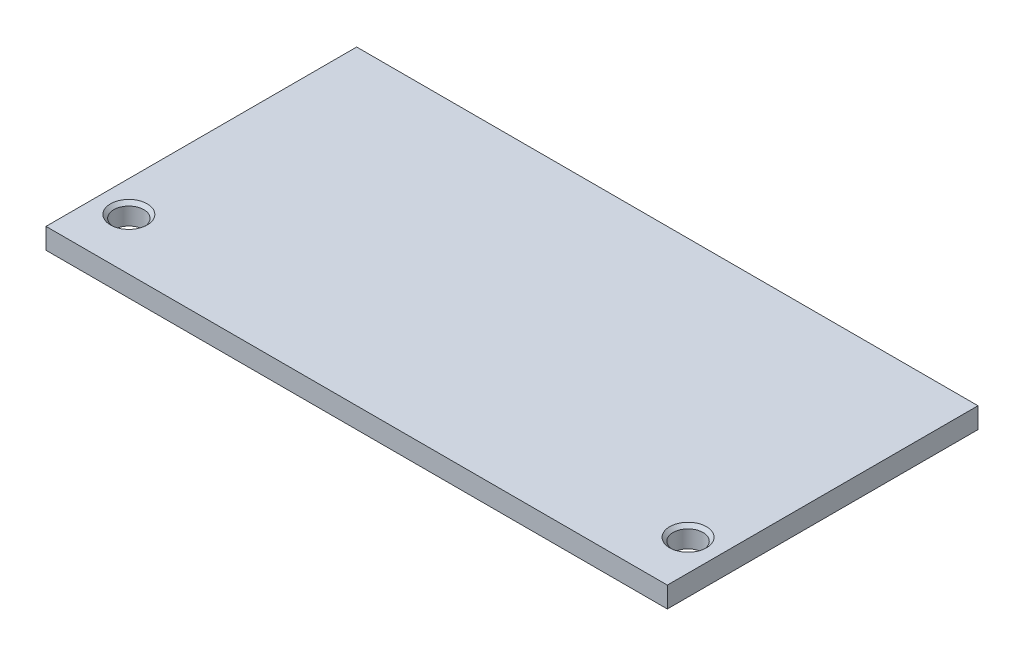
ISO-10303-21;
HEADER;
FILE_DESCRIPTION(('STEP AP214'),'2;1');
FILE_NAME('part.step','',(''),(''),'','','');
FILE_SCHEMA(('AUTOMOTIVE_DESIGN { 1 0 10303 214 1 1 1 1 }'));
ENDSEC;
DATA;
#1=APPLICATION_CONTEXT('core data for automotive mechanical design processes');
#2=APPLICATION_PROTOCOL_DEFINITION('international standard','automotive_design',2000,#1);
#3=PRODUCT_CONTEXT('',#1,'mechanical');
#4=PRODUCT('Part','Part','',(#3));
#5=PRODUCT_RELATED_PRODUCT_CATEGORY('part','',(#4));
#6=PRODUCT_DEFINITION_FORMATION('','',#4);
#7=PRODUCT_DEFINITION_CONTEXT('part definition',#1,'design');
#8=PRODUCT_DEFINITION('design','',#6,#7);
#9=PRODUCT_DEFINITION_SHAPE('','',#8);
#10=(LENGTH_UNIT() NAMED_UNIT(*) SI_UNIT(.MILLI.,.METRE.));
#11=(NAMED_UNIT(*) PLANE_ANGLE_UNIT() SI_UNIT($,.RADIAN.));
#12=(NAMED_UNIT(*) SI_UNIT($,.STERADIAN.) SOLID_ANGLE_UNIT());
#13=UNCERTAINTY_MEASURE_WITH_UNIT(LENGTH_MEASURE(1.E-05),#10,'distance_accuracy_value','');
#14=(GEOMETRIC_REPRESENTATION_CONTEXT(3) GLOBAL_UNCERTAINTY_ASSIGNED_CONTEXT((#13)) GLOBAL_UNIT_ASSIGNED_CONTEXT((#10,
#11,#12)) REPRESENTATION_CONTEXT('',''));
#15=CARTESIAN_POINT('',(0.,0.,0.));
#16=DIRECTION('',(0.,0.,1.));
#17=DIRECTION('',(1.,0.,0.));
#18=AXIS2_PLACEMENT_3D('',#15,#16,#17);
#19=CARTESIAN_POINT('',(0.,2.,0.));
#20=DIRECTION('',(1.,0.,0.));
#21=DIRECTION('',(0.,0.,-1.));
#22=AXIS2_PLACEMENT_3D('',#19,#20,#21);
#23=PLANE('',#22);
#24=DIRECTION('',(0.,0.,1.));
#25=VECTOR('',#24,1.);
#26=CARTESIAN_POINT('',(0.,0.,0.));
#27=LINE('',#26,#25);
#28=CARTESIAN_POINT('',(0.,0.,-30.));
#29=VERTEX_POINT('',#28);
#30=CARTESIAN_POINT('',(0.,0.,0.));
#31=VERTEX_POINT('',#30);
#32=EDGE_CURVE('E103',#29,#31,#27,.T.);
#33=ORIENTED_EDGE('',*,*,#32,.T.);
#34=DIRECTION('',(0.,-1.,0.));
#35=VECTOR('',#34,1.);
#36=CARTESIAN_POINT('',(0.,2.,0.));
#37=LINE('',#36,#35);
#38=CARTESIAN_POINT('',(0.,2.,0.));
#39=VERTEX_POINT('',#38);
#40=EDGE_CURVE('E11',#39,#31,#37,.T.);
#41=ORIENTED_EDGE('',*,*,#40,.F.);
#42=DIRECTION('',(0.,0.,1.));
#43=VECTOR('',#42,1.);
#44=CARTESIAN_POINT('',(0.,2.,0.));
#45=LINE('',#44,#43);
#46=CARTESIAN_POINT('',(0.,2.,-30.));
#47=VERTEX_POINT('',#46);
#48=EDGE_CURVE('E91',#47,#39,#45,.T.);
#49=ORIENTED_EDGE('',*,*,#48,.F.);
#50=DIRECTION('',(0.,-1.,0.));
#51=VECTOR('',#50,1.);
#52=CARTESIAN_POINT('',(0.,2.,-30.));
#53=LINE('',#52,#51);
#54=EDGE_CURVE('E99',#47,#29,#53,.T.);
#55=ORIENTED_EDGE('',*,*,#54,.T.);
#56=EDGE_LOOP('',(#33,#41,#49,#55));
#57=FACE_BOUND('',#56,.T.);
#58=ADVANCED_FACE('F40',(#57),#23,.F.);
#59=CARTESIAN_POINT('',(0.,2.,0.));
#60=DIRECTION('',(0.,0.,-1.));
#61=DIRECTION('',(-1.,0.,0.));
#62=AXIS2_PLACEMENT_3D('',#59,#60,#61);
#63=PLANE('',#62);
#64=DIRECTION('',(1.,0.,0.));
#65=VECTOR('',#64,1.);
#66=CARTESIAN_POINT('',(0.,0.,0.));
#67=LINE('',#66,#65);
#68=CARTESIAN_POINT('',(60.,0.,0.));
#69=VERTEX_POINT('',#68);
#70=EDGE_CURVE('E95',#31,#69,#67,.T.);
#71=ORIENTED_EDGE('',*,*,#70,.T.);
#72=DIRECTION('',(0.,-1.,0.));
#73=VECTOR('',#72,1.);
#74=CARTESIAN_POINT('',(60.,2.,0.));
#75=LINE('',#74,#73);
#76=CARTESIAN_POINT('',(60.,2.,0.));
#77=VERTEX_POINT('',#76);
#78=EDGE_CURVE('E48',#77,#69,#75,.T.);
#79=ORIENTED_EDGE('',*,*,#78,.F.);
#80=DIRECTION('',(1.,0.,0.));
#81=VECTOR('',#80,1.);
#82=CARTESIAN_POINT('',(0.,2.,0.));
#83=LINE('',#82,#81);
#84=EDGE_CURVE('E86',#39,#77,#83,.T.);
#85=ORIENTED_EDGE('',*,*,#84,.F.);
#86=ORIENTED_EDGE('',*,*,#40,.T.);
#87=EDGE_LOOP('',(#71,#79,#85,#86));
#88=FACE_BOUND('',#87,.T.);
#89=ADVANCED_FACE('F94',(#88),#63,.F.);
#90=CARTESIAN_POINT('',(60.,2.,0.));
#91=DIRECTION('',(-1.,0.,0.));
#92=DIRECTION('',(0.,0.,1.));
#93=AXIS2_PLACEMENT_3D('',#90,#91,#92);
#94=PLANE('',#93);
#95=DIRECTION('',(0.,0.,-1.));
#96=VECTOR('',#95,1.);
#97=CARTESIAN_POINT('',(60.,0.,0.));
#98=LINE('',#97,#96);
#99=CARTESIAN_POINT('',(60.,0.,-30.));
#100=VERTEX_POINT('',#99);
#101=EDGE_CURVE('E73',#69,#100,#98,.T.);
#102=ORIENTED_EDGE('',*,*,#101,.T.);
#103=DIRECTION('',(0.,-1.,0.));
#104=VECTOR('',#103,1.);
#105=CARTESIAN_POINT('',(60.,2.,-30.));
#106=LINE('',#105,#104);
#107=CARTESIAN_POINT('',(60.,2.,-30.));
#108=VERTEX_POINT('',#107);
#109=EDGE_CURVE('E96',#108,#100,#106,.T.);
#110=ORIENTED_EDGE('',*,*,#109,.F.);
#111=DIRECTION('',(0.,0.,-1.));
#112=VECTOR('',#111,1.);
#113=CARTESIAN_POINT('',(60.,2.,0.));
#114=LINE('',#113,#112);
#115=EDGE_CURVE('E89',#77,#108,#114,.T.);
#116=ORIENTED_EDGE('',*,*,#115,.F.);
#117=ORIENTED_EDGE('',*,*,#78,.T.);
#118=EDGE_LOOP('',(#102,#110,#116,#117));
#119=FACE_BOUND('',#118,.T.);
#120=ADVANCED_FACE('F97',(#119),#94,.F.);
#121=CARTESIAN_POINT('',(0.,2.,-30.));
#122=DIRECTION('',(0.,0.,1.));
#123=DIRECTION('',(1.,0.,0.));
#124=AXIS2_PLACEMENT_3D('',#121,#122,#123);
#125=PLANE('',#124);
#126=DIRECTION('',(-1.,0.,0.));
#127=VECTOR('',#126,1.);
#128=CARTESIAN_POINT('',(0.,0.,-30.));
#129=LINE('',#128,#127);
#130=EDGE_CURVE('E79',#100,#29,#129,.T.);
#131=ORIENTED_EDGE('',*,*,#130,.T.);
#132=ORIENTED_EDGE('',*,*,#54,.F.);
#133=DIRECTION('',(-1.,0.,0.));
#134=VECTOR('',#133,1.);
#135=CARTESIAN_POINT('',(0.,2.,-30.));
#136=LINE('',#135,#134);
#137=EDGE_CURVE('E56',#108,#47,#136,.T.);
#138=ORIENTED_EDGE('',*,*,#137,.F.);
#139=ORIENTED_EDGE('',*,*,#109,.T.);
#140=EDGE_LOOP('',(#131,#132,#138,#139));
#141=FACE_BOUND('',#140,.T.);
#142=ADVANCED_FACE('F111',(#141),#125,.F.);
#143=CARTESIAN_POINT('',(0.,2.,0.));
#144=DIRECTION('',(0.,-1.,0.));
#145=DIRECTION('',(0.,0.,-1.));
#146=AXIS2_PLACEMENT_3D('',#143,#144,#145);
#147=PLANE('',#146);
#148=CARTESIAN_POINT('',(57.,2.,-5.00000000000003));
#149=DIRECTION('',(0.,1.,0.));
#150=DIRECTION('',(0.,0.,1.));
#151=AXIS2_PLACEMENT_3D('',#148,#149,#150);
#152=CIRCLE('',#151,1.775);
#153=CARTESIAN_POINT('',(57.,2.,-3.22500000000003));
#154=VERTEX_POINT('',#153);
#155=EDGE_CURVE('E131',#154,#154,#152,.T.);
#156=ORIENTED_EDGE('',*,*,#155,.F.);
#157=EDGE_LOOP('',(#156));
#158=FACE_BOUND('',#157,.T.);
#159=CARTESIAN_POINT('',(3.,2.,-5.));
#160=DIRECTION('',(0.,1.,0.));
#161=DIRECTION('',(0.,0.,1.));
#162=AXIS2_PLACEMENT_3D('',#159,#160,#161);
#163=CIRCLE('',#162,1.775);
#164=CARTESIAN_POINT('',(3.,2.,-3.225));
#165=VERTEX_POINT('',#164);
#166=EDGE_CURVE('E122',#165,#165,#163,.T.);
#167=ORIENTED_EDGE('',*,*,#166,.F.);
#168=EDGE_LOOP('',(#167));
#169=FACE_BOUND('',#168,.T.);
#170=ORIENTED_EDGE('',*,*,#48,.T.);
#171=ORIENTED_EDGE('',*,*,#84,.T.);
#172=ORIENTED_EDGE('',*,*,#115,.T.);
#173=ORIENTED_EDGE('',*,*,#137,.T.);
#174=EDGE_LOOP('',(#170,#171,#172,#173));
#175=FACE_BOUND('',#174,.T.);
#176=ADVANCED_FACE('F87',(#158,#169,#175),#147,.F.);
#177=CARTESIAN_POINT('',(0.,0.,0.));
#178=DIRECTION('',(0.,-1.,0.));
#179=DIRECTION('',(0.,0.,-1.));
#180=AXIS2_PLACEMENT_3D('',#177,#178,#179);
#181=PLANE('',#180);
#182=CARTESIAN_POINT('',(57.,0.,-5.00000000000003));
#183=DIRECTION('',(0.,1.,0.));
#184=DIRECTION('',(0.,0.,1.));
#185=AXIS2_PLACEMENT_3D('',#182,#183,#184);
#186=CIRCLE('',#185,1.44999999999999);
#187=CARTESIAN_POINT('',(57.,0.,-3.55000000000004));
#188=VERTEX_POINT('',#187);
#189=EDGE_CURVE('E125',#188,#188,#186,.T.);
#190=ORIENTED_EDGE('',*,*,#189,.T.);
#191=EDGE_LOOP('',(#190));
#192=FACE_BOUND('',#191,.T.);
#193=CARTESIAN_POINT('',(3.,0.,-5.));
#194=DIRECTION('',(0.,1.,0.));
#195=DIRECTION('',(0.,0.,1.));
#196=AXIS2_PLACEMENT_3D('',#193,#194,#195);
#197=CIRCLE('',#196,1.44999999999999);
#198=CARTESIAN_POINT('',(3.,0.,-3.55000000000001));
#199=VERTEX_POINT('',#198);
#200=EDGE_CURVE('E106',#199,#199,#197,.T.);
#201=ORIENTED_EDGE('',*,*,#200,.T.);
#202=EDGE_LOOP('',(#201));
#203=FACE_BOUND('',#202,.T.);
#204=ORIENTED_EDGE('',*,*,#32,.F.);
#205=ORIENTED_EDGE('',*,*,#130,.F.);
#206=ORIENTED_EDGE('',*,*,#101,.F.);
#207=ORIENTED_EDGE('',*,*,#70,.F.);
#208=EDGE_LOOP('',(#204,#205,#206,#207));
#209=FACE_BOUND('',#208,.T.);
#210=ADVANCED_FACE('F114',(#192,#203,#209),#181,.T.);
#211=CARTESIAN_POINT('',(3.,2.,-5.));
#212=DIRECTION('',(0.,1.,0.));
#213=DIRECTION('',(0.,0.,1.));
#214=AXIS2_PLACEMENT_3D('',#211,#212,#213);
#215=CYLINDRICAL_SURFACE('',#214,1.44999999999999);
#216=ORIENTED_EDGE('',*,*,#200,.F.);
#217=EDGE_LOOP('',(#216));
#218=FACE_BOUND('',#217,.T.);
#219=CARTESIAN_POINT('',(3.,1.675,-5.));
#220=DIRECTION('',(0.,1.,0.));
#221=DIRECTION('',(0.,0.,1.));
#222=AXIS2_PLACEMENT_3D('',#219,#220,#221);
#223=CIRCLE('',#222,1.45);
#224=CARTESIAN_POINT('',(3.,1.675,-3.55));
#225=VERTEX_POINT('',#224);
#226=EDGE_CURVE('E119',#225,#225,#223,.T.);
#227=ORIENTED_EDGE('',*,*,#226,.T.);
#228=EDGE_LOOP('',(#227));
#229=FACE_BOUND('',#228,.T.);
#230=ADVANCED_FACE('F145',(#218,#229),#215,.F.);
#231=CARTESIAN_POINT('',(3.,2.,-5.));
#232=DIRECTION('',(0.,1.,0.));
#233=DIRECTION('',(0.,0.,1.));
#234=AXIS2_PLACEMENT_3D('',#231,#232,#233);
#235=CONICAL_SURFACE('',#234,1.775,0.785398163397447);
#236=ORIENTED_EDGE('',*,*,#226,.F.);
#237=EDGE_LOOP('',(#236));
#238=FACE_BOUND('',#237,.T.);
#239=ORIENTED_EDGE('',*,*,#166,.T.);
#240=EDGE_LOOP('',(#239));
#241=FACE_BOUND('',#240,.T.);
#242=ADVANCED_FACE('F142',(#238,#241),#235,.F.);
#243=CARTESIAN_POINT('',(57.,2.,-5.00000000000003));
#244=DIRECTION('',(0.,1.,0.));
#245=DIRECTION('',(0.,0.,1.));
#246=AXIS2_PLACEMENT_3D('',#243,#244,#245);
#247=CYLINDRICAL_SURFACE('',#246,1.44999999999999);
#248=ORIENTED_EDGE('',*,*,#189,.F.);
#249=EDGE_LOOP('',(#248));
#250=FACE_BOUND('',#249,.T.);
#251=CARTESIAN_POINT('',(57.,1.675,-5.00000000000003));
#252=DIRECTION('',(0.,1.,0.));
#253=DIRECTION('',(0.,0.,1.));
#254=AXIS2_PLACEMENT_3D('',#251,#252,#253);
#255=CIRCLE('',#254,1.45);
#256=CARTESIAN_POINT('',(57.,1.675,-3.55000000000003));
#257=VERTEX_POINT('',#256);
#258=EDGE_CURVE('E128',#257,#257,#255,.T.);
#259=ORIENTED_EDGE('',*,*,#258,.T.);
#260=EDGE_LOOP('',(#259));
#261=FACE_BOUND('',#260,.T.);
#262=ADVANCED_FACE('F144',(#250,#261),#247,.F.);
#263=CARTESIAN_POINT('',(57.,2.,-5.00000000000003));
#264=DIRECTION('',(0.,1.,0.));
#265=DIRECTION('',(0.,0.,1.));
#266=AXIS2_PLACEMENT_3D('',#263,#264,#265);
#267=CONICAL_SURFACE('',#266,1.775,0.785398163397445);
#268=ORIENTED_EDGE('',*,*,#258,.F.);
#269=EDGE_LOOP('',(#268));
#270=FACE_BOUND('',#269,.T.);
#271=ORIENTED_EDGE('',*,*,#155,.T.);
#272=EDGE_LOOP('',(#271));
#273=FACE_BOUND('',#272,.T.);
#274=ADVANCED_FACE('F135',(#270,#273),#267,.F.);
#275=CLOSED_SHELL('',(#58,#89,#120,#142,#176,#210,#230,#242,#262,#274));
#276=MANIFOLD_SOLID_BREP('B2',#275);
#277=ADVANCED_BREP_SHAPE_REPRESENTATION('',(#18,#276),#14);
#278=SHAPE_DEFINITION_REPRESENTATION(#9,#277);
ENDSEC;
END-ISO-10303-21;
